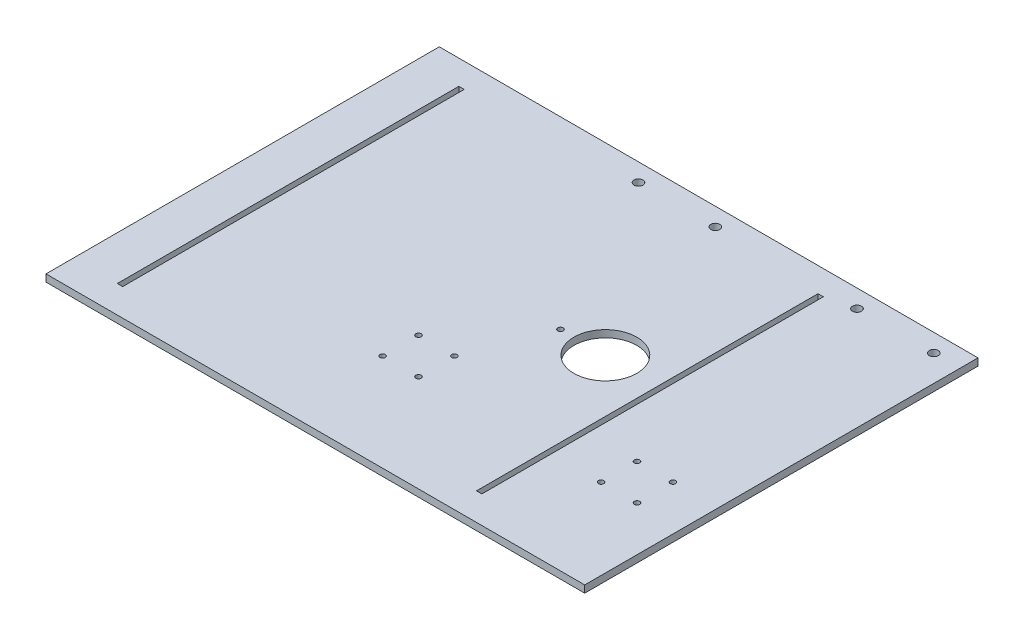
ISO-10303-21;
HEADER;
FILE_DESCRIPTION(('STEP AP214'),'2;1');
FILE_NAME('part.step','',(''),(''),'','','');
FILE_SCHEMA(('AUTOMOTIVE_DESIGN { 1 0 10303 214 1 1 1 1 }'));
ENDSEC;
DATA;
#1=APPLICATION_CONTEXT('core data for automotive mechanical design processes');
#2=APPLICATION_PROTOCOL_DEFINITION('international standard','automotive_design',2000,#1);
#3=PRODUCT_CONTEXT('',#1,'mechanical');
#4=PRODUCT('Part','Part','',(#3));
#5=PRODUCT_RELATED_PRODUCT_CATEGORY('part','',(#4));
#6=PRODUCT_DEFINITION_FORMATION('','',#4);
#7=PRODUCT_DEFINITION_CONTEXT('part definition',#1,'design');
#8=PRODUCT_DEFINITION('design','',#6,#7);
#9=PRODUCT_DEFINITION_SHAPE('','',#8);
#10=(LENGTH_UNIT() NAMED_UNIT(*) SI_UNIT(.MILLI.,.METRE.));
#11=(NAMED_UNIT(*) PLANE_ANGLE_UNIT() SI_UNIT($,.RADIAN.));
#12=(NAMED_UNIT(*) SI_UNIT($,.STERADIAN.) SOLID_ANGLE_UNIT());
#13=UNCERTAINTY_MEASURE_WITH_UNIT(LENGTH_MEASURE(1.E-05),#10,'distance_accuracy_value','');
#14=(GEOMETRIC_REPRESENTATION_CONTEXT(3) GLOBAL_UNCERTAINTY_ASSIGNED_CONTEXT((#13)) GLOBAL_UNIT_ASSIGNED_CONTEXT((#10,
#11,#12)) REPRESENTATION_CONTEXT('',''));
#15=CARTESIAN_POINT('',(0.,0.,0.));
#16=DIRECTION('',(0.,0.,1.));
#17=DIRECTION('',(1.,0.,0.));
#18=AXIS2_PLACEMENT_3D('',#15,#16,#17);
#19=CARTESIAN_POINT('',(0.,4.,0.));
#20=DIRECTION('',(0.,-1.,0.));
#21=DIRECTION('',(0.,0.,-1.));
#22=AXIS2_PLACEMENT_3D('',#19,#20,#21);
#23=PLANE('',#22);
#24=CARTESIAN_POINT('',(20.,4.,-7.00000000000002));
#25=DIRECTION('',(0.,-1.,0.));
#26=DIRECTION('',(0.,0.,-1.));
#27=AXIS2_PLACEMENT_3D('',#24,#25,#26);
#28=CIRCLE('',#27,1.5);
#29=CARTESIAN_POINT('',(20.,4.,-8.50000000000002));
#30=VERTEX_POINT('',#29);
#31=EDGE_CURVE('E271',#30,#30,#28,.T.);
#32=ORIENTED_EDGE('',*,*,#31,.T.);
#33=EDGE_LOOP('',(#32));
#34=FACE_BOUND('',#33,.T.);
#35=CARTESIAN_POINT('',(13.71,4.,-99.5));
#36=DIRECTION('',(0.,-1.,0.));
#37=DIRECTION('',(0.,0.,-1.));
#38=AXIS2_PLACEMENT_3D('',#35,#36,#37);
#39=CIRCLE('',#38,2.5);
#40=CARTESIAN_POINT('',(13.71,4.,-102.));
#41=VERTEX_POINT('',#40);
#42=EDGE_CURVE('E260',#41,#41,#39,.T.);
#43=ORIENTED_EDGE('',*,*,#42,.T.);
#44=EDGE_LOOP('',(#43));
#45=FACE_BOUND('',#44,.T.);
#46=CARTESIAN_POINT('',(-29.07,4.,-99.5));
#47=DIRECTION('',(0.,-1.,0.));
#48=DIRECTION('',(0.,0.,-1.));
#49=AXIS2_PLACEMENT_3D('',#46,#47,#48);
#50=CIRCLE('',#49,2.5);
#51=CARTESIAN_POINT('',(-29.07,4.,-102.));
#52=VERTEX_POINT('',#51);
#53=EDGE_CURVE('E266',#52,#52,#50,.T.);
#54=ORIENTED_EDGE('',*,*,#53,.T.);
#55=EDGE_LOOP('',(#54));
#56=FACE_BOUND('',#55,.T.);
#57=CARTESIAN_POINT('',(135.39,4.,-99.5));
#58=DIRECTION('',(0.,-1.,0.));
#59=DIRECTION('',(0.,0.,-1.));
#60=AXIS2_PLACEMENT_3D('',#57,#58,#59);
#61=CIRCLE('',#60,2.5);
#62=CARTESIAN_POINT('',(135.39,4.,-102.));
#63=VERTEX_POINT('',#62);
#64=EDGE_CURVE('E255',#63,#63,#61,.T.);
#65=ORIENTED_EDGE('',*,*,#64,.T.);
#66=EDGE_LOOP('',(#65));
#67=FACE_BOUND('',#66,.T.);
#68=CARTESIAN_POINT('',(92.61,4.,-99.5));
#69=DIRECTION('',(0.,-1.,0.));
#70=DIRECTION('',(0.,0.,-1.));
#71=AXIS2_PLACEMENT_3D('',#68,#69,#70);
#72=CIRCLE('',#71,2.50000000000001);
#73=CARTESIAN_POINT('',(92.61,4.,-102.));
#74=VERTEX_POINT('',#73);
#75=EDGE_CURVE('E264',#74,#74,#72,.T.);
#76=ORIENTED_EDGE('',*,*,#75,.T.);
#77=EDGE_LOOP('',(#76));
#78=FACE_BOUND('',#77,.T.);
#79=CARTESIAN_POINT('',(-16.68,4.,55.39));
#80=DIRECTION('',(0.,-1.,0.));
#81=DIRECTION('',(0.,0.,-1.));
#82=AXIS2_PLACEMENT_3D('',#79,#80,#81);
#83=CIRCLE('',#82,1.5);
#84=CARTESIAN_POINT('',(-16.68,4.,53.89));
#85=VERTEX_POINT('',#84);
#86=EDGE_CURVE('E257',#85,#85,#83,.T.);
#87=ORIENTED_EDGE('',*,*,#86,.T.);
#88=EDGE_LOOP('',(#87));
#89=FACE_BOUND('',#88,.T.);
#90=CARTESIAN_POINT('',(-16.68,4.,35.39));
#91=DIRECTION('',(0.,-1.,0.));
#92=DIRECTION('',(0.,0.,-1.));
#93=AXIS2_PLACEMENT_3D('',#90,#91,#92);
#94=CIRCLE('',#93,1.5);
#95=CARTESIAN_POINT('',(-16.68,4.,33.89));
#96=VERTEX_POINT('',#95);
#97=EDGE_CURVE('E283',#96,#96,#94,.T.);
#98=ORIENTED_EDGE('',*,*,#97,.T.);
#99=EDGE_LOOP('',(#98));
#100=FACE_BOUND('',#99,.T.);
#101=CARTESIAN_POINT('',(3.31999999999999,4.,35.39));
#102=DIRECTION('',(0.,-1.,0.));
#103=DIRECTION('',(0.,0.,-1.));
#104=AXIS2_PLACEMENT_3D('',#101,#102,#103);
#105=CIRCLE('',#104,1.5);
#106=CARTESIAN_POINT('',(3.31999999999999,4.,33.89));
#107=VERTEX_POINT('',#106);
#108=EDGE_CURVE('E280',#107,#107,#105,.T.);
#109=ORIENTED_EDGE('',*,*,#108,.T.);
#110=EDGE_LOOP('',(#109));
#111=FACE_BOUND('',#110,.T.);
#112=CARTESIAN_POINT('',(3.31999999999999,4.,55.39));
#113=DIRECTION('',(0.,-1.,0.));
#114=DIRECTION('',(0.,0.,-1.));
#115=AXIS2_PLACEMENT_3D('',#112,#113,#114);
#116=CIRCLE('',#115,1.5);
#117=CARTESIAN_POINT('',(3.31999999999999,4.,53.89));
#118=VERTEX_POINT('',#117);
#119=EDGE_CURVE('E241',#118,#118,#116,.T.);
#120=ORIENTED_EDGE('',*,*,#119,.T.);
#121=EDGE_LOOP('',(#120));
#122=FACE_BOUND('',#121,.T.);
#123=CARTESIAN_POINT('',(105.,4.,55.39));
#124=DIRECTION('',(0.,-1.,0.));
#125=DIRECTION('',(0.,0.,-1.));
#126=AXIS2_PLACEMENT_3D('',#123,#124,#125);
#127=CIRCLE('',#126,1.5);
#128=CARTESIAN_POINT('',(105.,4.,53.89));
#129=VERTEX_POINT('',#128);
#130=EDGE_CURVE('E250',#129,#129,#127,.T.);
#131=ORIENTED_EDGE('',*,*,#130,.T.);
#132=EDGE_LOOP('',(#131));
#133=FACE_BOUND('',#132,.T.);
#134=CARTESIAN_POINT('',(105.,4.,35.39));
#135=DIRECTION('',(0.,-1.,0.));
#136=DIRECTION('',(0.,0.,-1.));
#137=AXIS2_PLACEMENT_3D('',#134,#135,#136);
#138=CIRCLE('',#137,1.5);
#139=CARTESIAN_POINT('',(105.,4.,33.89));
#140=VERTEX_POINT('',#139);
#141=EDGE_CURVE('E293',#140,#140,#138,.T.);
#142=ORIENTED_EDGE('',*,*,#141,.T.);
#143=EDGE_LOOP('',(#142));
#144=FACE_BOUND('',#143,.T.);
#145=CARTESIAN_POINT('',(125.,4.,35.39));
#146=DIRECTION('',(0.,-1.,0.));
#147=DIRECTION('',(0.,0.,-1.));
#148=AXIS2_PLACEMENT_3D('',#145,#146,#147);
#149=CIRCLE('',#148,1.5);
#150=CARTESIAN_POINT('',(125.,4.,33.89));
#151=VERTEX_POINT('',#150);
#152=EDGE_CURVE('E290',#151,#151,#149,.T.);
#153=ORIENTED_EDGE('',*,*,#152,.T.);
#154=EDGE_LOOP('',(#153));
#155=FACE_BOUND('',#154,.T.);
#156=CARTESIAN_POINT('',(125.,4.,55.39));
#157=DIRECTION('',(0.,-1.,0.));
#158=DIRECTION('',(0.,0.,-1.));
#159=AXIS2_PLACEMENT_3D('',#156,#157,#158);
#160=CIRCLE('',#159,1.5);
#161=CARTESIAN_POINT('',(125.,4.,53.89));
#162=VERTEX_POINT('',#161);
#163=EDGE_CURVE('E227',#162,#162,#160,.T.);
#164=ORIENTED_EDGE('',*,*,#163,.T.);
#165=EDGE_LOOP('',(#164));
#166=FACE_BOUND('',#165,.T.);
#167=CARTESIAN_POINT('',(45.,4.,-7.00000000000002));
#168=DIRECTION('',(0.,-1.,0.));
#169=DIRECTION('',(0.,0.,-1.));
#170=AXIS2_PLACEMENT_3D('',#167,#168,#169);
#171=CIRCLE('',#170,17.5);
#172=CARTESIAN_POINT('',(45.,4.,-24.5));
#173=VERTEX_POINT('',#172);
#174=EDGE_CURVE('E157',#173,#173,#171,.T.);
#175=ORIENTED_EDGE('',*,*,#174,.T.);
#176=EDGE_LOOP('',(#175));
#177=FACE_BOUND('',#176,.T.);
#178=DIRECTION('',(-1.,0.,0.));
#179=VECTOR('',#178,1.);
#180=CARTESIAN_POINT('',(-122.5,4.,-95.8859395802149));
#181=LINE('',#180,#179);
#182=CARTESIAN_POINT('',(-122.5,4.,-95.8859395802149));
#183=VERTEX_POINT('',#182);
#184=CARTESIAN_POINT('',(-125.5,4.,-95.8859395802149));
#185=VERTEX_POINT('',#184);
#186=EDGE_CURVE('E167',#183,#185,#181,.T.);
#187=ORIENTED_EDGE('',*,*,#186,.F.);
#188=DIRECTION('',(0.,0.,-1.));
#189=VECTOR('',#188,1.);
#190=CARTESIAN_POINT('',(-122.5,4.,94.2851089201768));
#191=LINE('',#190,#189);
#192=CARTESIAN_POINT('',(-122.5,4.,94.2851089201768));
#193=VERTEX_POINT('',#192);
#194=EDGE_CURVE('E175',#193,#183,#191,.T.);
#195=ORIENTED_EDGE('',*,*,#194,.F.);
#196=DIRECTION('',(1.,0.,0.));
#197=VECTOR('',#196,1.);
#198=CARTESIAN_POINT('',(-125.5,4.,94.2851089201768));
#199=LINE('',#198,#197);
#200=CARTESIAN_POINT('',(-125.5,4.,94.2851089201768));
#201=VERTEX_POINT('',#200);
#202=EDGE_CURVE('E172',#201,#193,#199,.T.);
#203=ORIENTED_EDGE('',*,*,#202,.F.);
#204=DIRECTION('',(0.,0.,1.));
#205=VECTOR('',#204,1.);
#206=CARTESIAN_POINT('',(-125.5,4.,-95.8859395802149));
#207=LINE('',#206,#205);
#208=EDGE_CURVE('E169',#185,#201,#207,.T.);
#209=ORIENTED_EDGE('',*,*,#208,.F.);
#210=EDGE_LOOP('',(#187,#195,#203,#209));
#211=FACE_BOUND('',#210,.T.);
#212=DIRECTION('',(0.,0.,-1.));
#213=VECTOR('',#212,1.);
#214=CARTESIAN_POINT('',(150.,4.,109.5));
#215=LINE('',#214,#213);
#216=CARTESIAN_POINT('',(150.,4.,109.5));
#217=VERTEX_POINT('',#216);
#218=CARTESIAN_POINT('',(150.,4.,-109.5));
#219=VERTEX_POINT('',#218);
#220=EDGE_CURVE('E198',#217,#219,#215,.T.);
#221=ORIENTED_EDGE('',*,*,#220,.T.);
#222=DIRECTION('',(-1.,0.,0.));
#223=VECTOR('',#222,1.);
#224=CARTESIAN_POINT('',(-150.,4.,-109.5));
#225=LINE('',#224,#223);
#226=CARTESIAN_POINT('',(-150.,4.,-109.5));
#227=VERTEX_POINT('',#226);
#228=EDGE_CURVE('E201',#219,#227,#225,.T.);
#229=ORIENTED_EDGE('',*,*,#228,.T.);
#230=DIRECTION('',(0.,0.,1.));
#231=VECTOR('',#230,1.);
#232=CARTESIAN_POINT('',(-150.,4.,109.5));
#233=LINE('',#232,#231);
#234=CARTESIAN_POINT('',(-150.,4.,109.5));
#235=VERTEX_POINT('',#234);
#236=EDGE_CURVE('E204',#227,#235,#233,.T.);
#237=ORIENTED_EDGE('',*,*,#236,.T.);
#238=DIRECTION('',(1.,0.,0.));
#239=VECTOR('',#238,1.);
#240=CARTESIAN_POINT('',(-150.,4.,109.5));
#241=LINE('',#240,#239);
#242=EDGE_CURVE('E206',#235,#217,#241,.T.);
#243=ORIENTED_EDGE('',*,*,#242,.T.);
#244=EDGE_LOOP('',(#221,#229,#237,#243));
#245=FACE_BOUND('',#244,.T.);
#246=DIRECTION('',(1.,0.,0.));
#247=VECTOR('',#246,1.);
#248=CARTESIAN_POINT('',(74.5,4.,94.2851089201768));
#249=LINE('',#248,#247);
#250=CARTESIAN_POINT('',(74.5,4.,94.2851089201768));
#251=VERTEX_POINT('',#250);
#252=CARTESIAN_POINT('',(77.5,4.,94.2851089201768));
#253=VERTEX_POINT('',#252);
#254=EDGE_CURVE('E129',#251,#253,#249,.T.);
#255=ORIENTED_EDGE('',*,*,#254,.F.);
#256=DIRECTION('',(0.,0.,1.));
#257=VECTOR('',#256,1.);
#258=CARTESIAN_POINT('',(74.5,4.,-95.8859395802149));
#259=LINE('',#258,#257);
#260=CARTESIAN_POINT('',(74.5,4.,-95.8859395802149));
#261=VERTEX_POINT('',#260);
#262=EDGE_CURVE('E151',#261,#251,#259,.T.);
#263=ORIENTED_EDGE('',*,*,#262,.F.);
#264=DIRECTION('',(-1.,0.,0.));
#265=VECTOR('',#264,1.);
#266=CARTESIAN_POINT('',(77.5,4.,-95.8859395802149));
#267=LINE('',#266,#265);
#268=CARTESIAN_POINT('',(77.5,4.,-95.8859395802149));
#269=VERTEX_POINT('',#268);
#270=EDGE_CURVE('E149',#269,#261,#267,.T.);
#271=ORIENTED_EDGE('',*,*,#270,.F.);
#272=DIRECTION('',(0.,0.,-1.));
#273=VECTOR('',#272,1.);
#274=CARTESIAN_POINT('',(77.5,4.,94.2851089201768));
#275=LINE('',#274,#273);
#276=EDGE_CURVE('E137',#253,#269,#275,.T.);
#277=ORIENTED_EDGE('',*,*,#276,.F.);
#278=EDGE_LOOP('',(#255,#263,#271,#277));
#279=FACE_BOUND('',#278,.T.);
#280=ADVANCED_FACE('F38',(#34,#45,#56,#67,#78,#89,#100,#111,#122,#133,#144,#155,#166,#177,#211,
#245,#279),#23,.F.);
#281=CARTESIAN_POINT('',(0.,0.,0.));
#282=DIRECTION('',(0.,-1.,0.));
#283=DIRECTION('',(0.,0.,-1.));
#284=AXIS2_PLACEMENT_3D('',#281,#282,#283);
#285=PLANE('',#284);
#286=CARTESIAN_POINT('',(20.,0.,-7.00000000000002));
#287=DIRECTION('',(0.,1.,0.));
#288=DIRECTION('',(0.,0.,1.));
#289=AXIS2_PLACEMENT_3D('',#286,#287,#288);
#290=CIRCLE('',#289,1.5);
#291=CARTESIAN_POINT('',(20.,0.,-5.50000000000002));
#292=VERTEX_POINT('',#291);
#293=EDGE_CURVE('E661',#292,#292,#290,.T.);
#294=ORIENTED_EDGE('',*,*,#293,.T.);
#295=EDGE_LOOP('',(#294));
#296=FACE_BOUND('',#295,.T.);
#297=CARTESIAN_POINT('',(13.71,0.,-99.5));
#298=DIRECTION('',(0.,-1.,0.));
#299=DIRECTION('',(0.,0.,-1.));
#300=AXIS2_PLACEMENT_3D('',#297,#298,#299);
#301=CIRCLE('',#300,2.5);
#302=CARTESIAN_POINT('',(13.71,0.,-102.));
#303=VERTEX_POINT('',#302);
#304=EDGE_CURVE('E42',#303,#303,#301,.T.);
#305=ORIENTED_EDGE('',*,*,#304,.F.);
#306=EDGE_LOOP('',(#305));
#307=FACE_BOUND('',#306,.T.);
#308=CARTESIAN_POINT('',(-29.07,0.,-99.5));
#309=DIRECTION('',(0.,-1.,0.));
#310=DIRECTION('',(0.,0.,-1.));
#311=AXIS2_PLACEMENT_3D('',#308,#309,#310);
#312=CIRCLE('',#311,2.5);
#313=CARTESIAN_POINT('',(-29.07,0.,-102.));
#314=VERTEX_POINT('',#313);
#315=EDGE_CURVE('E258',#314,#314,#312,.T.);
#316=ORIENTED_EDGE('',*,*,#315,.F.);
#317=EDGE_LOOP('',(#316));
#318=FACE_BOUND('',#317,.T.);
#319=CARTESIAN_POINT('',(135.39,0.,-99.5));
#320=DIRECTION('',(0.,-1.,0.));
#321=DIRECTION('',(0.,0.,-1.));
#322=AXIS2_PLACEMENT_3D('',#319,#320,#321);
#323=CIRCLE('',#322,2.5);
#324=CARTESIAN_POINT('',(135.39,0.,-102.));
#325=VERTEX_POINT('',#324);
#326=EDGE_CURVE('E254',#325,#325,#323,.T.);
#327=ORIENTED_EDGE('',*,*,#326,.F.);
#328=EDGE_LOOP('',(#327));
#329=FACE_BOUND('',#328,.T.);
#330=CARTESIAN_POINT('',(92.61,0.,-99.5));
#331=DIRECTION('',(0.,-1.,0.));
#332=DIRECTION('',(0.,0.,-1.));
#333=AXIS2_PLACEMENT_3D('',#330,#331,#332);
#334=CIRCLE('',#333,2.50000000000001);
#335=CARTESIAN_POINT('',(92.61,0.,-102.));
#336=VERTEX_POINT('',#335);
#337=EDGE_CURVE('E251',#336,#336,#334,.T.);
#338=ORIENTED_EDGE('',*,*,#337,.F.);
#339=EDGE_LOOP('',(#338));
#340=FACE_BOUND('',#339,.T.);
#341=CARTESIAN_POINT('',(-16.68,0.,55.39));
#342=DIRECTION('',(0.,-1.,0.));
#343=DIRECTION('',(0.,0.,-1.));
#344=AXIS2_PLACEMENT_3D('',#341,#342,#343);
#345=CIRCLE('',#344,1.5);
#346=CARTESIAN_POINT('',(-16.68,0.,53.89));
#347=VERTEX_POINT('',#346);
#348=EDGE_CURVE('E247',#347,#347,#345,.T.);
#349=ORIENTED_EDGE('',*,*,#348,.F.);
#350=EDGE_LOOP('',(#349));
#351=FACE_BOUND('',#350,.T.);
#352=CARTESIAN_POINT('',(-16.68,0.,35.39));
#353=DIRECTION('',(0.,-1.,0.));
#354=DIRECTION('',(0.,0.,-1.));
#355=AXIS2_PLACEMENT_3D('',#352,#353,#354);
#356=CIRCLE('',#355,1.5);
#357=CARTESIAN_POINT('',(-16.68,0.,33.89));
#358=VERTEX_POINT('',#357);
#359=EDGE_CURVE('E244',#358,#358,#356,.T.);
#360=ORIENTED_EDGE('',*,*,#359,.F.);
#361=EDGE_LOOP('',(#360));
#362=FACE_BOUND('',#361,.T.);
#363=CARTESIAN_POINT('',(3.31999999999999,0.,35.39));
#364=DIRECTION('',(0.,-1.,0.));
#365=DIRECTION('',(0.,0.,-1.));
#366=AXIS2_PLACEMENT_3D('',#363,#364,#365);
#367=CIRCLE('',#366,1.5);
#368=CARTESIAN_POINT('',(3.31999999999999,0.,33.89));
#369=VERTEX_POINT('',#368);
#370=EDGE_CURVE('E240',#369,#369,#367,.T.);
#371=ORIENTED_EDGE('',*,*,#370,.F.);
#372=EDGE_LOOP('',(#371));
#373=FACE_BOUND('',#372,.T.);
#374=CARTESIAN_POINT('',(3.31999999999999,0.,55.39));
#375=DIRECTION('',(0.,-1.,0.));
#376=DIRECTION('',(0.,0.,-1.));
#377=AXIS2_PLACEMENT_3D('',#374,#375,#376);
#378=CIRCLE('',#377,1.5);
#379=CARTESIAN_POINT('',(3.31999999999999,0.,53.89));
#380=VERTEX_POINT('',#379);
#381=EDGE_CURVE('E237',#380,#380,#378,.T.);
#382=ORIENTED_EDGE('',*,*,#381,.F.);
#383=EDGE_LOOP('',(#382));
#384=FACE_BOUND('',#383,.T.);
#385=CARTESIAN_POINT('',(105.,0.,55.39));
#386=DIRECTION('',(0.,-1.,0.));
#387=DIRECTION('',(0.,0.,-1.));
#388=AXIS2_PLACEMENT_3D('',#385,#386,#387);
#389=CIRCLE('',#388,1.5);
#390=CARTESIAN_POINT('',(105.,0.,53.89));
#391=VERTEX_POINT('',#390);
#392=EDGE_CURVE('E233',#391,#391,#389,.T.);
#393=ORIENTED_EDGE('',*,*,#392,.F.);
#394=EDGE_LOOP('',(#393));
#395=FACE_BOUND('',#394,.T.);
#396=CARTESIAN_POINT('',(105.,0.,35.39));
#397=DIRECTION('',(0.,-1.,0.));
#398=DIRECTION('',(0.,0.,-1.));
#399=AXIS2_PLACEMENT_3D('',#396,#397,#398);
#400=CIRCLE('',#399,1.5);
#401=CARTESIAN_POINT('',(105.,0.,33.89));
#402=VERTEX_POINT('',#401);
#403=EDGE_CURVE('E230',#402,#402,#400,.T.);
#404=ORIENTED_EDGE('',*,*,#403,.F.);
#405=EDGE_LOOP('',(#404));
#406=FACE_BOUND('',#405,.T.);
#407=CARTESIAN_POINT('',(125.,0.,35.39));
#408=DIRECTION('',(0.,-1.,0.));
#409=DIRECTION('',(0.,0.,-1.));
#410=AXIS2_PLACEMENT_3D('',#407,#408,#409);
#411=CIRCLE('',#410,1.5);
#412=CARTESIAN_POINT('',(125.,0.,33.89));
#413=VERTEX_POINT('',#412);
#414=EDGE_CURVE('E226',#413,#413,#411,.T.);
#415=ORIENTED_EDGE('',*,*,#414,.F.);
#416=EDGE_LOOP('',(#415));
#417=FACE_BOUND('',#416,.T.);
#418=CARTESIAN_POINT('',(125.,0.,55.39));
#419=DIRECTION('',(0.,-1.,0.));
#420=DIRECTION('',(0.,0.,-1.));
#421=AXIS2_PLACEMENT_3D('',#418,#419,#420);
#422=CIRCLE('',#421,1.5);
#423=CARTESIAN_POINT('',(125.,0.,53.89));
#424=VERTEX_POINT('',#423);
#425=EDGE_CURVE('E223',#424,#424,#422,.T.);
#426=ORIENTED_EDGE('',*,*,#425,.F.);
#427=EDGE_LOOP('',(#426));
#428=FACE_BOUND('',#427,.T.);
#429=CARTESIAN_POINT('',(45.,0.,-7.00000000000002));
#430=DIRECTION('',(0.,-1.,0.));
#431=DIRECTION('',(0.,0.,-1.));
#432=AXIS2_PLACEMENT_3D('',#429,#430,#431);
#433=CIRCLE('',#432,17.5);
#434=CARTESIAN_POINT('',(45.,0.,-24.5));
#435=VERTEX_POINT('',#434);
#436=EDGE_CURVE('E236',#435,#435,#433,.T.);
#437=ORIENTED_EDGE('',*,*,#436,.F.);
#438=EDGE_LOOP('',(#437));
#439=FACE_BOUND('',#438,.T.);
#440=DIRECTION('',(0.,0.,-1.));
#441=VECTOR('',#440,1.);
#442=CARTESIAN_POINT('',(150.,0.,109.5));
#443=LINE('',#442,#441);
#444=CARTESIAN_POINT('',(150.,0.,109.5));
#445=VERTEX_POINT('',#444);
#446=CARTESIAN_POINT('',(150.,0.,-109.5));
#447=VERTEX_POINT('',#446);
#448=EDGE_CURVE('E197',#445,#447,#443,.T.);
#449=ORIENTED_EDGE('',*,*,#448,.F.);
#450=DIRECTION('',(1.,0.,0.));
#451=VECTOR('',#450,1.);
#452=CARTESIAN_POINT('',(-150.,0.,109.5));
#453=LINE('',#452,#451);
#454=CARTESIAN_POINT('',(-150.,0.,109.5));
#455=VERTEX_POINT('',#454);
#456=EDGE_CURVE('E202',#455,#445,#453,.T.);
#457=ORIENTED_EDGE('',*,*,#456,.F.);
#458=DIRECTION('',(0.,0.,1.));
#459=VECTOR('',#458,1.);
#460=CARTESIAN_POINT('',(-150.,0.,109.5));
#461=LINE('',#460,#459);
#462=CARTESIAN_POINT('',(-150.,0.,-109.5));
#463=VERTEX_POINT('',#462);
#464=EDGE_CURVE('E213',#463,#455,#461,.T.);
#465=ORIENTED_EDGE('',*,*,#464,.F.);
#466=DIRECTION('',(-1.,0.,0.));
#467=VECTOR('',#466,1.);
#468=CARTESIAN_POINT('',(-150.,0.,-109.5));
#469=LINE('',#468,#467);
#470=EDGE_CURVE('E211',#447,#463,#469,.T.);
#471=ORIENTED_EDGE('',*,*,#470,.F.);
#472=EDGE_LOOP('',(#449,#457,#465,#471));
#473=FACE_BOUND('',#472,.T.);
#474=DIRECTION('',(0.,0.,-1.));
#475=VECTOR('',#474,1.);
#476=CARTESIAN_POINT('',(-122.5,0.,94.2851089201768));
#477=LINE('',#476,#475);
#478=CARTESIAN_POINT('',(-122.5,0.,94.2851089201768));
#479=VERTEX_POINT('',#478);
#480=CARTESIAN_POINT('',(-122.5,0.,-95.8859395802149));
#481=VERTEX_POINT('',#480);
#482=EDGE_CURVE('E170',#479,#481,#477,.T.);
#483=ORIENTED_EDGE('',*,*,#482,.T.);
#484=DIRECTION('',(-1.,0.,0.));
#485=VECTOR('',#484,1.);
#486=CARTESIAN_POINT('',(-122.5,0.,-95.8859395802149));
#487=LINE('',#486,#485);
#488=CARTESIAN_POINT('',(-125.5,0.,-95.8859395802149));
#489=VERTEX_POINT('',#488);
#490=EDGE_CURVE('E145',#481,#489,#487,.T.);
#491=ORIENTED_EDGE('',*,*,#490,.T.);
#492=DIRECTION('',(0.,0.,1.));
#493=VECTOR('',#492,1.);
#494=CARTESIAN_POINT('',(-125.5,0.,-95.8859395802149));
#495=LINE('',#494,#493);
#496=CARTESIAN_POINT('',(-125.5,0.,94.2851089201768));
#497=VERTEX_POINT('',#496);
#498=EDGE_CURVE('E180',#489,#497,#495,.T.);
#499=ORIENTED_EDGE('',*,*,#498,.T.);
#500=DIRECTION('',(1.,0.,0.));
#501=VECTOR('',#500,1.);
#502=CARTESIAN_POINT('',(-125.5,0.,94.2851089201768));
#503=LINE('',#502,#501);
#504=EDGE_CURVE('E183',#497,#479,#503,.T.);
#505=ORIENTED_EDGE('',*,*,#504,.T.);
#506=EDGE_LOOP('',(#483,#491,#499,#505));
#507=FACE_BOUND('',#506,.T.);
#508=DIRECTION('',(0.,0.,1.));
#509=VECTOR('',#508,1.);
#510=CARTESIAN_POINT('',(74.5,0.,-95.8859395802149));
#511=LINE('',#510,#509);
#512=CARTESIAN_POINT('',(74.5,0.,-95.8859395802149));
#513=VERTEX_POINT('',#512);
#514=CARTESIAN_POINT('',(74.5,0.,94.2851089201768));
#515=VERTEX_POINT('',#514);
#516=EDGE_CURVE('E138',#513,#515,#511,.T.);
#517=ORIENTED_EDGE('',*,*,#516,.T.);
#518=DIRECTION('',(1.,0.,0.));
#519=VECTOR('',#518,1.);
#520=CARTESIAN_POINT('',(74.5,0.,94.2851089201768));
#521=LINE('',#520,#519);
#522=CARTESIAN_POINT('',(77.5,0.,94.2851089201768));
#523=VERTEX_POINT('',#522);
#524=EDGE_CURVE('E63',#515,#523,#521,.T.);
#525=ORIENTED_EDGE('',*,*,#524,.T.);
#526=DIRECTION('',(0.,0.,-1.));
#527=VECTOR('',#526,1.);
#528=CARTESIAN_POINT('',(77.5,0.,94.2851089201768));
#529=LINE('',#528,#527);
#530=CARTESIAN_POINT('',(77.5,0.,-95.8859395802149));
#531=VERTEX_POINT('',#530);
#532=EDGE_CURVE('E144',#523,#531,#529,.T.);
#533=ORIENTED_EDGE('',*,*,#532,.T.);
#534=DIRECTION('',(-1.,0.,0.));
#535=VECTOR('',#534,1.);
#536=CARTESIAN_POINT('',(77.5,0.,-95.8859395802149));
#537=LINE('',#536,#535);
#538=EDGE_CURVE('E159',#531,#513,#537,.T.);
#539=ORIENTED_EDGE('',*,*,#538,.T.);
#540=EDGE_LOOP('',(#517,#525,#533,#539));
#541=FACE_BOUND('',#540,.T.);
#542=ADVANCED_FACE('F306',(#296,#307,#318,#329,#340,#351,#362,#373,#384,#395,#406,#417,#428,
#439,#473,#507,#541),#285,.T.);
#543=CARTESIAN_POINT('',(150.,4.,109.5));
#544=DIRECTION('',(-1.,0.,0.));
#545=DIRECTION('',(0.,0.,1.));
#546=AXIS2_PLACEMENT_3D('',#543,#544,#545);
#547=PLANE('',#546);
#548=ORIENTED_EDGE('',*,*,#448,.T.);
#549=DIRECTION('',(0.,-1.,0.));
#550=VECTOR('',#549,1.);
#551=CARTESIAN_POINT('',(150.,4.,-109.5));
#552=LINE('',#551,#550);
#553=EDGE_CURVE('E11',#219,#447,#552,.T.);
#554=ORIENTED_EDGE('',*,*,#553,.F.);
#555=ORIENTED_EDGE('',*,*,#220,.F.);
#556=DIRECTION('',(0.,-1.,0.));
#557=VECTOR('',#556,1.);
#558=CARTESIAN_POINT('',(150.,4.,109.5));
#559=LINE('',#558,#557);
#560=EDGE_CURVE('E208',#217,#445,#559,.T.);
#561=ORIENTED_EDGE('',*,*,#560,.T.);
#562=EDGE_LOOP('',(#548,#554,#555,#561));
#563=FACE_BOUND('',#562,.T.);
#564=ADVANCED_FACE('F40',(#563),#547,.F.);
#565=CARTESIAN_POINT('',(-150.,4.,-109.5));
#566=DIRECTION('',(0.,0.,1.));
#567=DIRECTION('',(1.,0.,0.));
#568=AXIS2_PLACEMENT_3D('',#565,#566,#567);
#569=PLANE('',#568);
#570=ORIENTED_EDGE('',*,*,#470,.T.);
#571=DIRECTION('',(0.,-1.,0.));
#572=VECTOR('',#571,1.);
#573=CARTESIAN_POINT('',(-150.,4.,-109.5));
#574=LINE('',#573,#572);
#575=EDGE_CURVE('E47',#227,#463,#574,.T.);
#576=ORIENTED_EDGE('',*,*,#575,.F.);
#577=ORIENTED_EDGE('',*,*,#228,.F.);
#578=ORIENTED_EDGE('',*,*,#553,.T.);
#579=EDGE_LOOP('',(#570,#576,#577,#578));
#580=FACE_BOUND('',#579,.T.);
#581=ADVANCED_FACE('F346',(#580),#569,.F.);
#582=CARTESIAN_POINT('',(-150.,4.,109.5));
#583=DIRECTION('',(1.,0.,0.));
#584=DIRECTION('',(0.,0.,-1.));
#585=AXIS2_PLACEMENT_3D('',#582,#583,#584);
#586=PLANE('',#585);
#587=ORIENTED_EDGE('',*,*,#464,.T.);
#588=DIRECTION('',(0.,-1.,0.));
#589=VECTOR('',#588,1.);
#590=CARTESIAN_POINT('',(-150.,4.,109.5));
#591=LINE('',#590,#589);
#592=EDGE_CURVE('E218',#235,#455,#591,.T.);
#593=ORIENTED_EDGE('',*,*,#592,.F.);
#594=ORIENTED_EDGE('',*,*,#236,.F.);
#595=ORIENTED_EDGE('',*,*,#575,.T.);
#596=EDGE_LOOP('',(#587,#593,#594,#595));
#597=FACE_BOUND('',#596,.T.);
#598=ADVANCED_FACE('F343',(#597),#586,.F.);
#599=CARTESIAN_POINT('',(-150.,4.,109.5));
#600=DIRECTION('',(0.,0.,-1.));
#601=DIRECTION('',(-1.,0.,0.));
#602=AXIS2_PLACEMENT_3D('',#599,#600,#601);
#603=PLANE('',#602);
#604=ORIENTED_EDGE('',*,*,#456,.T.);
#605=ORIENTED_EDGE('',*,*,#560,.F.);
#606=ORIENTED_EDGE('',*,*,#242,.F.);
#607=ORIENTED_EDGE('',*,*,#592,.T.);
#608=EDGE_LOOP('',(#604,#605,#606,#607));
#609=FACE_BOUND('',#608,.T.);
#610=ADVANCED_FACE('F340',(#609),#603,.F.);
#611=CARTESIAN_POINT('',(-122.5,4.,-95.8859395802149));
#612=DIRECTION('',(0.,0.,1.));
#613=DIRECTION('',(1.,0.,0.));
#614=AXIS2_PLACEMENT_3D('',#611,#612,#613);
#615=PLANE('',#614);
#616=ORIENTED_EDGE('',*,*,#490,.F.);
#617=DIRECTION('',(0.,-1.,0.));
#618=VECTOR('',#617,1.);
#619=CARTESIAN_POINT('',(-122.5,4.,-95.8859395802149));
#620=LINE('',#619,#618);
#621=EDGE_CURVE('E177',#183,#481,#620,.T.);
#622=ORIENTED_EDGE('',*,*,#621,.F.);
#623=ORIENTED_EDGE('',*,*,#186,.T.);
#624=DIRECTION('',(0.,-1.,0.));
#625=VECTOR('',#624,1.);
#626=CARTESIAN_POINT('',(-125.5,4.,-95.8859395802149));
#627=LINE('',#626,#625);
#628=EDGE_CURVE('E194',#185,#489,#627,.T.);
#629=ORIENTED_EDGE('',*,*,#628,.T.);
#630=EDGE_LOOP('',(#616,#622,#623,#629));
#631=FACE_BOUND('',#630,.T.);
#632=ADVANCED_FACE('F337',(#631),#615,.T.);
#633=CARTESIAN_POINT('',(-125.5,4.,-95.8859395802149));
#634=DIRECTION('',(1.,0.,0.));
#635=DIRECTION('',(0.,0.,-1.));
#636=AXIS2_PLACEMENT_3D('',#633,#634,#635);
#637=PLANE('',#636);
#638=ORIENTED_EDGE('',*,*,#498,.F.);
#639=ORIENTED_EDGE('',*,*,#628,.F.);
#640=ORIENTED_EDGE('',*,*,#208,.T.);
#641=DIRECTION('',(0.,-1.,0.));
#642=VECTOR('',#641,1.);
#643=CARTESIAN_POINT('',(-125.5,4.,94.2851089201768));
#644=LINE('',#643,#642);
#645=EDGE_CURVE('E192',#201,#497,#644,.T.);
#646=ORIENTED_EDGE('',*,*,#645,.T.);
#647=EDGE_LOOP('',(#638,#639,#640,#646));
#648=FACE_BOUND('',#647,.T.);
#649=ADVANCED_FACE('F527',(#648),#637,.T.);
#650=CARTESIAN_POINT('',(-125.5,4.,94.2851089201768));
#651=DIRECTION('',(0.,0.,-1.));
#652=DIRECTION('',(-1.,0.,0.));
#653=AXIS2_PLACEMENT_3D('',#650,#651,#652);
#654=PLANE('',#653);
#655=ORIENTED_EDGE('',*,*,#504,.F.);
#656=ORIENTED_EDGE('',*,*,#645,.F.);
#657=ORIENTED_EDGE('',*,*,#202,.T.);
#658=DIRECTION('',(0.,-1.,0.));
#659=VECTOR('',#658,1.);
#660=CARTESIAN_POINT('',(-122.5,4.,94.2851089201768));
#661=LINE('',#660,#659);
#662=EDGE_CURVE('E190',#193,#479,#661,.T.);
#663=ORIENTED_EDGE('',*,*,#662,.T.);
#664=EDGE_LOOP('',(#655,#656,#657,#663));
#665=FACE_BOUND('',#664,.T.);
#666=ADVANCED_FACE('F517',(#665),#654,.T.);
#667=CARTESIAN_POINT('',(-122.5,4.,94.2851089201768));
#668=DIRECTION('',(-1.,0.,0.));
#669=DIRECTION('',(0.,0.,1.));
#670=AXIS2_PLACEMENT_3D('',#667,#668,#669);
#671=PLANE('',#670);
#672=ORIENTED_EDGE('',*,*,#482,.F.);
#673=ORIENTED_EDGE('',*,*,#662,.F.);
#674=ORIENTED_EDGE('',*,*,#194,.T.);
#675=ORIENTED_EDGE('',*,*,#621,.T.);
#676=EDGE_LOOP('',(#672,#673,#674,#675));
#677=FACE_BOUND('',#676,.T.);
#678=ADVANCED_FACE('F508',(#677),#671,.T.);
#679=CARTESIAN_POINT('',(74.5,4.,94.2851089201768));
#680=DIRECTION('',(0.,0.,-1.));
#681=DIRECTION('',(-1.,0.,0.));
#682=AXIS2_PLACEMENT_3D('',#679,#680,#681);
#683=PLANE('',#682);
#684=ORIENTED_EDGE('',*,*,#524,.F.);
#685=DIRECTION('',(0.,-1.,0.));
#686=VECTOR('',#685,1.);
#687=CARTESIAN_POINT('',(74.5,4.,94.2851089201768));
#688=LINE('',#687,#686);
#689=EDGE_CURVE('E133',#251,#515,#688,.T.);
#690=ORIENTED_EDGE('',*,*,#689,.F.);
#691=ORIENTED_EDGE('',*,*,#254,.T.);
#692=DIRECTION('',(0.,-1.,0.));
#693=VECTOR('',#692,1.);
#694=CARTESIAN_POINT('',(77.5,4.,94.2851089201768));
#695=LINE('',#694,#693);
#696=EDGE_CURVE('E132',#253,#523,#695,.T.);
#697=ORIENTED_EDGE('',*,*,#696,.T.);
#698=EDGE_LOOP('',(#684,#690,#691,#697));
#699=FACE_BOUND('',#698,.T.);
#700=ADVANCED_FACE('F131',(#699),#683,.T.);
#701=CARTESIAN_POINT('',(77.5,4.,94.2851089201768));
#702=DIRECTION('',(-1.,0.,0.));
#703=DIRECTION('',(0.,0.,1.));
#704=AXIS2_PLACEMENT_3D('',#701,#702,#703);
#705=PLANE('',#704);
#706=ORIENTED_EDGE('',*,*,#532,.F.);
#707=ORIENTED_EDGE('',*,*,#696,.F.);
#708=ORIENTED_EDGE('',*,*,#276,.T.);
#709=DIRECTION('',(0.,-1.,0.));
#710=VECTOR('',#709,1.);
#711=CARTESIAN_POINT('',(77.5,4.,-95.8859395802149));
#712=LINE('',#711,#710);
#713=EDGE_CURVE('E146',#269,#531,#712,.T.);
#714=ORIENTED_EDGE('',*,*,#713,.T.);
#715=EDGE_LOOP('',(#706,#707,#708,#714));
#716=FACE_BOUND('',#715,.T.);
#717=ADVANCED_FACE('F141',(#716),#705,.T.);
#718=CARTESIAN_POINT('',(77.5,4.,-95.8859395802149));
#719=DIRECTION('',(0.,0.,1.));
#720=DIRECTION('',(1.,0.,0.));
#721=AXIS2_PLACEMENT_3D('',#718,#719,#720);
#722=PLANE('',#721);
#723=ORIENTED_EDGE('',*,*,#538,.F.);
#724=ORIENTED_EDGE('',*,*,#713,.F.);
#725=ORIENTED_EDGE('',*,*,#270,.T.);
#726=DIRECTION('',(0.,-1.,0.));
#727=VECTOR('',#726,1.);
#728=CARTESIAN_POINT('',(74.5,4.,-95.8859395802149));
#729=LINE('',#728,#727);
#730=EDGE_CURVE('E55',#261,#513,#729,.T.);
#731=ORIENTED_EDGE('',*,*,#730,.T.);
#732=EDGE_LOOP('',(#723,#724,#725,#731));
#733=FACE_BOUND('',#732,.T.);
#734=ADVANCED_FACE('F319',(#733),#722,.T.);
#735=CARTESIAN_POINT('',(74.5,4.,-95.8859395802149));
#736=DIRECTION('',(1.,0.,0.));
#737=DIRECTION('',(0.,0.,-1.));
#738=AXIS2_PLACEMENT_3D('',#735,#736,#737);
#739=PLANE('',#738);
#740=ORIENTED_EDGE('',*,*,#516,.F.);
#741=ORIENTED_EDGE('',*,*,#730,.F.);
#742=ORIENTED_EDGE('',*,*,#262,.T.);
#743=ORIENTED_EDGE('',*,*,#689,.T.);
#744=EDGE_LOOP('',(#740,#741,#742,#743));
#745=FACE_BOUND('',#744,.T.);
#746=ADVANCED_FACE('F317',(#745),#739,.T.);
#747=CARTESIAN_POINT('',(45.,4.,-7.00000000000002));
#748=DIRECTION('',(0.,-1.,0.));
#749=DIRECTION('',(0.,0.,-1.));
#750=AXIS2_PLACEMENT_3D('',#747,#748,#749);
#751=CYLINDRICAL_SURFACE('',#750,17.5);
#752=ORIENTED_EDGE('',*,*,#174,.F.);
#753=EDGE_LOOP('',(#752));
#754=FACE_BOUND('',#753,.T.);
#755=ORIENTED_EDGE('',*,*,#436,.T.);
#756=EDGE_LOOP('',(#755));
#757=FACE_BOUND('',#756,.T.);
#758=ADVANCED_FACE('F304',(#754,#757),#751,.F.);
#759=CARTESIAN_POINT('',(125.,4.,55.39));
#760=DIRECTION('',(0.,-1.,0.));
#761=DIRECTION('',(0.,0.,-1.));
#762=AXIS2_PLACEMENT_3D('',#759,#760,#761);
#763=CYLINDRICAL_SURFACE('',#762,1.5);
#764=ORIENTED_EDGE('',*,*,#425,.T.);
#765=EDGE_LOOP('',(#764));
#766=FACE_BOUND('',#765,.T.);
#767=ORIENTED_EDGE('',*,*,#163,.F.);
#768=EDGE_LOOP('',(#767));
#769=FACE_BOUND('',#768,.T.);
#770=ADVANCED_FACE('F325',(#766,#769),#763,.F.);
#771=CARTESIAN_POINT('',(125.,4.,35.39));
#772=DIRECTION('',(0.,-1.,0.));
#773=DIRECTION('',(0.,0.,-1.));
#774=AXIS2_PLACEMENT_3D('',#771,#772,#773);
#775=CYLINDRICAL_SURFACE('',#774,1.5);
#776=ORIENTED_EDGE('',*,*,#414,.T.);
#777=EDGE_LOOP('',(#776));
#778=FACE_BOUND('',#777,.T.);
#779=ORIENTED_EDGE('',*,*,#152,.F.);
#780=EDGE_LOOP('',(#779));
#781=FACE_BOUND('',#780,.T.);
#782=ADVANCED_FACE('F461',(#778,#781),#775,.F.);
#783=CARTESIAN_POINT('',(105.,4.,35.39));
#784=DIRECTION('',(0.,-1.,0.));
#785=DIRECTION('',(0.,0.,-1.));
#786=AXIS2_PLACEMENT_3D('',#783,#784,#785);
#787=CYLINDRICAL_SURFACE('',#786,1.5);
#788=ORIENTED_EDGE('',*,*,#403,.T.);
#789=EDGE_LOOP('',(#788));
#790=FACE_BOUND('',#789,.T.);
#791=ORIENTED_EDGE('',*,*,#141,.F.);
#792=EDGE_LOOP('',(#791));
#793=FACE_BOUND('',#792,.T.);
#794=ADVANCED_FACE('F453',(#790,#793),#787,.F.);
#795=CARTESIAN_POINT('',(105.,4.,55.39));
#796=DIRECTION('',(0.,-1.,0.));
#797=DIRECTION('',(0.,0.,-1.));
#798=AXIS2_PLACEMENT_3D('',#795,#796,#797);
#799=CYLINDRICAL_SURFACE('',#798,1.5);
#800=ORIENTED_EDGE('',*,*,#392,.T.);
#801=EDGE_LOOP('',(#800));
#802=FACE_BOUND('',#801,.T.);
#803=ORIENTED_EDGE('',*,*,#130,.F.);
#804=EDGE_LOOP('',(#803));
#805=FACE_BOUND('',#804,.T.);
#806=ADVANCED_FACE('F445',(#802,#805),#799,.F.);
#807=CARTESIAN_POINT('',(3.31999999999999,4.,55.39));
#808=DIRECTION('',(0.,-1.,0.));
#809=DIRECTION('',(0.,0.,-1.));
#810=AXIS2_PLACEMENT_3D('',#807,#808,#809);
#811=CYLINDRICAL_SURFACE('',#810,1.5);
#812=ORIENTED_EDGE('',*,*,#381,.T.);
#813=EDGE_LOOP('',(#812));
#814=FACE_BOUND('',#813,.T.);
#815=ORIENTED_EDGE('',*,*,#119,.F.);
#816=EDGE_LOOP('',(#815));
#817=FACE_BOUND('',#816,.T.);
#818=ADVANCED_FACE('F437',(#814,#817),#811,.F.);
#819=CARTESIAN_POINT('',(3.31999999999999,4.,35.39));
#820=DIRECTION('',(0.,-1.,0.));
#821=DIRECTION('',(0.,0.,-1.));
#822=AXIS2_PLACEMENT_3D('',#819,#820,#821);
#823=CYLINDRICAL_SURFACE('',#822,1.5);
#824=ORIENTED_EDGE('',*,*,#370,.T.);
#825=EDGE_LOOP('',(#824));
#826=FACE_BOUND('',#825,.T.);
#827=ORIENTED_EDGE('',*,*,#108,.F.);
#828=EDGE_LOOP('',(#827));
#829=FACE_BOUND('',#828,.T.);
#830=ADVANCED_FACE('F429',(#826,#829),#823,.F.);
#831=CARTESIAN_POINT('',(-16.68,4.,35.39));
#832=DIRECTION('',(0.,-1.,0.));
#833=DIRECTION('',(0.,0.,-1.));
#834=AXIS2_PLACEMENT_3D('',#831,#832,#833);
#835=CYLINDRICAL_SURFACE('',#834,1.5);
#836=ORIENTED_EDGE('',*,*,#359,.T.);
#837=EDGE_LOOP('',(#836));
#838=FACE_BOUND('',#837,.T.);
#839=ORIENTED_EDGE('',*,*,#97,.F.);
#840=EDGE_LOOP('',(#839));
#841=FACE_BOUND('',#840,.T.);
#842=ADVANCED_FACE('F421',(#838,#841),#835,.F.);
#843=CARTESIAN_POINT('',(-16.68,4.,55.39));
#844=DIRECTION('',(0.,-1.,0.));
#845=DIRECTION('',(0.,0.,-1.));
#846=AXIS2_PLACEMENT_3D('',#843,#844,#845);
#847=CYLINDRICAL_SURFACE('',#846,1.5);
#848=ORIENTED_EDGE('',*,*,#348,.T.);
#849=EDGE_LOOP('',(#848));
#850=FACE_BOUND('',#849,.T.);
#851=ORIENTED_EDGE('',*,*,#86,.F.);
#852=EDGE_LOOP('',(#851));
#853=FACE_BOUND('',#852,.T.);
#854=ADVANCED_FACE('F413',(#850,#853),#847,.F.);
#855=CARTESIAN_POINT('',(92.61,4.,-99.5));
#856=DIRECTION('',(0.,-1.,0.));
#857=DIRECTION('',(0.,0.,-1.));
#858=AXIS2_PLACEMENT_3D('',#855,#856,#857);
#859=CYLINDRICAL_SURFACE('',#858,2.50000000000001);
#860=ORIENTED_EDGE('',*,*,#337,.T.);
#861=EDGE_LOOP('',(#860));
#862=FACE_BOUND('',#861,.T.);
#863=ORIENTED_EDGE('',*,*,#75,.F.);
#864=EDGE_LOOP('',(#863));
#865=FACE_BOUND('',#864,.T.);
#866=ADVANCED_FACE('F405',(#862,#865),#859,.F.);
#867=CARTESIAN_POINT('',(135.39,4.,-99.5));
#868=DIRECTION('',(0.,-1.,0.));
#869=DIRECTION('',(0.,0.,-1.));
#870=AXIS2_PLACEMENT_3D('',#867,#868,#869);
#871=CYLINDRICAL_SURFACE('',#870,2.5);
#872=ORIENTED_EDGE('',*,*,#326,.T.);
#873=EDGE_LOOP('',(#872));
#874=FACE_BOUND('',#873,.T.);
#875=ORIENTED_EDGE('',*,*,#64,.F.);
#876=EDGE_LOOP('',(#875));
#877=FACE_BOUND('',#876,.T.);
#878=ADVANCED_FACE('F398',(#874,#877),#871,.F.);
#879=CARTESIAN_POINT('',(-29.07,4.,-99.5));
#880=DIRECTION('',(0.,-1.,0.));
#881=DIRECTION('',(0.,0.,-1.));
#882=AXIS2_PLACEMENT_3D('',#879,#880,#881);
#883=CYLINDRICAL_SURFACE('',#882,2.5);
#884=ORIENTED_EDGE('',*,*,#315,.T.);
#885=EDGE_LOOP('',(#884));
#886=FACE_BOUND('',#885,.T.);
#887=ORIENTED_EDGE('',*,*,#53,.F.);
#888=EDGE_LOOP('',(#887));
#889=FACE_BOUND('',#888,.T.);
#890=ADVANCED_FACE('F391',(#886,#889),#883,.F.);
#891=CARTESIAN_POINT('',(13.71,4.,-99.5));
#892=DIRECTION('',(0.,-1.,0.));
#893=DIRECTION('',(0.,0.,-1.));
#894=AXIS2_PLACEMENT_3D('',#891,#892,#893);
#895=CYLINDRICAL_SURFACE('',#894,2.5);
#896=ORIENTED_EDGE('',*,*,#304,.T.);
#897=EDGE_LOOP('',(#896));
#898=FACE_BOUND('',#897,.T.);
#899=ORIENTED_EDGE('',*,*,#42,.F.);
#900=EDGE_LOOP('',(#899));
#901=FACE_BOUND('',#900,.T.);
#902=ADVANCED_FACE('F381',(#898,#901),#895,.F.);
#903=CARTESIAN_POINT('',(20.,0.,-7.00000000000002));
#904=DIRECTION('',(0.,1.,0.));
#905=DIRECTION('',(0.,0.,1.));
#906=AXIS2_PLACEMENT_3D('',#903,#904,#905);
#907=CYLINDRICAL_SURFACE('',#906,1.5);
#908=ORIENTED_EDGE('',*,*,#293,.F.);
#909=EDGE_LOOP('',(#908));
#910=FACE_BOUND('',#909,.T.);
#911=ORIENTED_EDGE('',*,*,#31,.F.);
#912=EDGE_LOOP('',(#911));
#913=FACE_BOUND('',#912,.T.);
#914=ADVANCED_FACE('F377',(#910,#913),#907,.F.);
#915=CLOSED_SHELL('',(#280,#542,#564,#581,#598,#610,#632,#649,#666,#678,#700,#717,#734,#746,
#758,#770,#782,#794,#806,#818,#830,#842,#854,#866,#878,#890,#902,#914));
#916=MANIFOLD_SOLID_BREP('B2',#915);
#917=ADVANCED_BREP_SHAPE_REPRESENTATION('',(#18,#916),#14);
#918=SHAPE_DEFINITION_REPRESENTATION(#9,#917);
ENDSEC;
END-ISO-10303-21;
